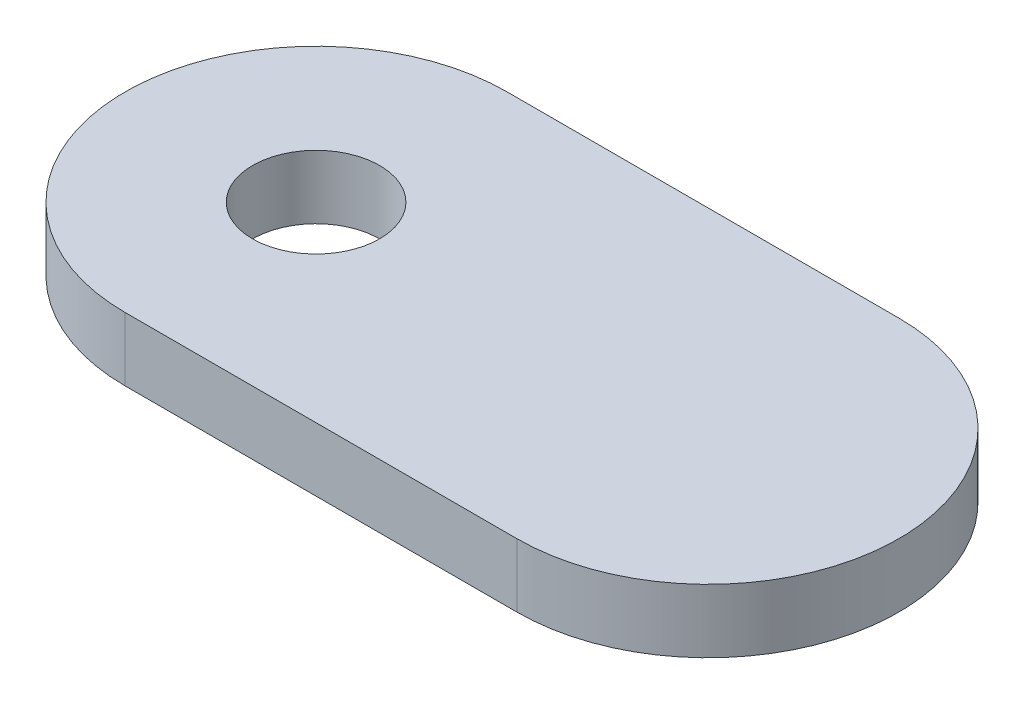
ISO-10303-21;
HEADER;
FILE_DESCRIPTION(('STEP AP214'),'2;1');
FILE_NAME('part.step','',(''),(''),'','','');
FILE_SCHEMA(('AUTOMOTIVE_DESIGN { 1 0 10303 214 1 1 1 1 }'));
ENDSEC;
DATA;
#1=APPLICATION_CONTEXT('core data for automotive mechanical design processes');
#2=APPLICATION_PROTOCOL_DEFINITION('international standard','automotive_design',2000,#1);
#3=PRODUCT_CONTEXT('',#1,'mechanical');
#4=PRODUCT('Part','Part','',(#3));
#5=PRODUCT_RELATED_PRODUCT_CATEGORY('part','',(#4));
#6=PRODUCT_DEFINITION_FORMATION('','',#4);
#7=PRODUCT_DEFINITION_CONTEXT('part definition',#1,'design');
#8=PRODUCT_DEFINITION('design','',#6,#7);
#9=PRODUCT_DEFINITION_SHAPE('','',#8);
#10=(LENGTH_UNIT() NAMED_UNIT(*) SI_UNIT(.MILLI.,.METRE.));
#11=(NAMED_UNIT(*) PLANE_ANGLE_UNIT() SI_UNIT($,.RADIAN.));
#12=(NAMED_UNIT(*) SI_UNIT($,.STERADIAN.) SOLID_ANGLE_UNIT());
#13=UNCERTAINTY_MEASURE_WITH_UNIT(LENGTH_MEASURE(1.E-05),#10,'distance_accuracy_value','');
#14=(GEOMETRIC_REPRESENTATION_CONTEXT(3) GLOBAL_UNCERTAINTY_ASSIGNED_CONTEXT((#13)) GLOBAL_UNIT_ASSIGNED_CONTEXT((#10,
#11,#12)) REPRESENTATION_CONTEXT('',''));
#15=CARTESIAN_POINT('',(0.,0.,0.));
#16=DIRECTION('',(0.,0.,1.));
#17=DIRECTION('',(1.,0.,0.));
#18=AXIS2_PLACEMENT_3D('',#15,#16,#17);
#19=CARTESIAN_POINT('',(0.,10.,0.));
#20=DIRECTION('',(0.,-1.,0.));
#21=DIRECTION('',(0.,0.,-1.));
#22=AXIS2_PLACEMENT_3D('',#19,#20,#21);
#23=CYLINDRICAL_SURFACE('',#22,30.0320866894288);
#24=CARTESIAN_POINT('',(0.,0.,0.));
#25=DIRECTION('',(0.,1.,0.));
#26=DIRECTION('',(0.,0.,1.));
#27=AXIS2_PLACEMENT_3D('',#24,#25,#26);
#28=CIRCLE('',#27,30.0320866894288);
#29=CARTESIAN_POINT('',(0.,0.,-30.0320866894288));
#30=VERTEX_POINT('',#29);
#31=CARTESIAN_POINT('',(0.,0.,30.0320866894288));
#32=VERTEX_POINT('',#31);
#33=EDGE_CURVE('E98',#30,#32,#28,.T.);
#34=ORIENTED_EDGE('',*,*,#33,.T.);
#35=DIRECTION('',(0.,-1.,0.));
#36=VECTOR('',#35,1.);
#37=CARTESIAN_POINT('',(0.,10.,30.0320866894288));
#38=LINE('',#37,#36);
#39=CARTESIAN_POINT('',(0.,10.,30.0320866894288));
#40=VERTEX_POINT('',#39);
#41=EDGE_CURVE('E11',#40,#32,#38,.T.);
#42=ORIENTED_EDGE('',*,*,#41,.F.);
#43=CARTESIAN_POINT('',(0.,10.,0.));
#44=DIRECTION('',(0.,1.,0.));
#45=DIRECTION('',(0.,0.,1.));
#46=AXIS2_PLACEMENT_3D('',#43,#44,#45);
#47=CIRCLE('',#46,30.0320866894288);
#48=CARTESIAN_POINT('',(0.,10.,-30.0320866894288));
#49=VERTEX_POINT('',#48);
#50=EDGE_CURVE('E86',#49,#40,#47,.T.);
#51=ORIENTED_EDGE('',*,*,#50,.F.);
#52=DIRECTION('',(0.,-1.,0.));
#53=VECTOR('',#52,1.);
#54=CARTESIAN_POINT('',(0.,10.,-30.0320866894288));
#55=LINE('',#54,#53);
#56=EDGE_CURVE('E94',#49,#30,#55,.T.);
#57=ORIENTED_EDGE('',*,*,#56,.T.);
#58=EDGE_LOOP('',(#34,#42,#51,#57));
#59=FACE_BOUND('',#58,.T.);
#60=ADVANCED_FACE('F35',(#59),#23,.T.);
#61=CARTESIAN_POINT('',(0.,10.,30.0320866894288));
#62=DIRECTION('',(0.,0.,-1.));
#63=DIRECTION('',(-1.,0.,0.));
#64=AXIS2_PLACEMENT_3D('',#61,#62,#63);
#65=PLANE('',#64);
#66=DIRECTION('',(1.,0.,0.));
#67=VECTOR('',#66,1.);
#68=CARTESIAN_POINT('',(0.,0.,30.0320866894288));
#69=LINE('',#68,#67);
#70=CARTESIAN_POINT('',(61.6042803885719,0.,30.0320866894288));
#71=VERTEX_POINT('',#70);
#72=EDGE_CURVE('E90',#32,#71,#69,.T.);
#73=ORIENTED_EDGE('',*,*,#72,.T.);
#74=DIRECTION('',(0.,-1.,0.));
#75=VECTOR('',#74,1.);
#76=CARTESIAN_POINT('',(61.6042803885719,10.,30.0320866894288));
#77=LINE('',#76,#75);
#78=CARTESIAN_POINT('',(61.6042803885719,10.,30.0320866894288));
#79=VERTEX_POINT('',#78);
#80=EDGE_CURVE('E43',#79,#71,#77,.T.);
#81=ORIENTED_EDGE('',*,*,#80,.F.);
#82=DIRECTION('',(1.,0.,0.));
#83=VECTOR('',#82,1.);
#84=CARTESIAN_POINT('',(0.,10.,30.0320866894288));
#85=LINE('',#84,#83);
#86=EDGE_CURVE('E81',#40,#79,#85,.T.);
#87=ORIENTED_EDGE('',*,*,#86,.F.);
#88=ORIENTED_EDGE('',*,*,#41,.T.);
#89=EDGE_LOOP('',(#73,#81,#87,#88));
#90=FACE_BOUND('',#89,.T.);
#91=ADVANCED_FACE('F89',(#90),#65,.F.);
#92=CARTESIAN_POINT('',(61.6042803885719,10.,0.));
#93=DIRECTION('',(0.,-1.,0.));
#94=DIRECTION('',(0.,0.,-1.));
#95=AXIS2_PLACEMENT_3D('',#92,#93,#94);
#96=CYLINDRICAL_SURFACE('',#95,30.0320866894288);
#97=CARTESIAN_POINT('',(61.6042803885719,0.,0.));
#98=DIRECTION('',(0.,1.,0.));
#99=DIRECTION('',(0.,0.,1.));
#100=AXIS2_PLACEMENT_3D('',#97,#98,#99);
#101=CIRCLE('',#100,30.0320866894288);
#102=CARTESIAN_POINT('',(61.6042803885719,0.,-30.0320866894288));
#103=VERTEX_POINT('',#102);
#104=EDGE_CURVE('E68',#71,#103,#101,.T.);
#105=ORIENTED_EDGE('',*,*,#104,.T.);
#106=DIRECTION('',(0.,-1.,0.));
#107=VECTOR('',#106,1.);
#108=CARTESIAN_POINT('',(61.6042803885719,10.,-30.0320866894288));
#109=LINE('',#108,#107);
#110=CARTESIAN_POINT('',(61.6042803885719,10.,-30.0320866894288));
#111=VERTEX_POINT('',#110);
#112=EDGE_CURVE('E91',#111,#103,#109,.T.);
#113=ORIENTED_EDGE('',*,*,#112,.F.);
#114=CARTESIAN_POINT('',(61.6042803885719,10.,0.));
#115=DIRECTION('',(0.,1.,0.));
#116=DIRECTION('',(0.,0.,1.));
#117=AXIS2_PLACEMENT_3D('',#114,#115,#116);
#118=CIRCLE('',#117,30.0320866894288);
#119=EDGE_CURVE('E84',#79,#111,#118,.T.);
#120=ORIENTED_EDGE('',*,*,#119,.F.);
#121=ORIENTED_EDGE('',*,*,#80,.T.);
#122=EDGE_LOOP('',(#105,#113,#120,#121));
#123=FACE_BOUND('',#122,.T.);
#124=ADVANCED_FACE('F92',(#123),#96,.T.);
#125=CARTESIAN_POINT('',(0.,10.,-30.0320866894288));
#126=DIRECTION('',(0.,0.,1.));
#127=DIRECTION('',(1.,0.,0.));
#128=AXIS2_PLACEMENT_3D('',#125,#126,#127);
#129=PLANE('',#128);
#130=DIRECTION('',(-1.,0.,0.));
#131=VECTOR('',#130,1.);
#132=CARTESIAN_POINT('',(0.,0.,-30.0320866894288));
#133=LINE('',#132,#131);
#134=EDGE_CURVE('E74',#103,#30,#133,.T.);
#135=ORIENTED_EDGE('',*,*,#134,.T.);
#136=ORIENTED_EDGE('',*,*,#56,.F.);
#137=DIRECTION('',(-1.,0.,0.));
#138=VECTOR('',#137,1.);
#139=CARTESIAN_POINT('',(0.,10.,-30.0320866894288));
#140=LINE('',#139,#138);
#141=EDGE_CURVE('E51',#111,#49,#140,.T.);
#142=ORIENTED_EDGE('',*,*,#141,.F.);
#143=ORIENTED_EDGE('',*,*,#112,.T.);
#144=EDGE_LOOP('',(#135,#136,#142,#143));
#145=FACE_BOUND('',#144,.T.);
#146=ADVANCED_FACE('F106',(#145),#129,.F.);
#147=CARTESIAN_POINT('',(0.,10.,0.));
#148=DIRECTION('',(0.,1.,0.));
#149=DIRECTION('',(0.,0.,1.));
#150=AXIS2_PLACEMENT_3D('',#147,#148,#149);
#151=PLANE('',#150);
#152=CARTESIAN_POINT('',(0.,10.,0.));
#153=DIRECTION('',(0.,1.,0.));
#154=DIRECTION('',(0.,0.,1.));
#155=AXIS2_PLACEMENT_3D('',#152,#153,#154);
#156=CIRCLE('',#155,9.99307311000058);
#157=CARTESIAN_POINT('',(0.,10.,9.99307311000058));
#158=VERTEX_POINT('',#157);
#159=EDGE_CURVE('E114',#158,#158,#156,.T.);
#160=ORIENTED_EDGE('',*,*,#159,.F.);
#161=EDGE_LOOP('',(#160));
#162=FACE_BOUND('',#161,.T.);
#163=ORIENTED_EDGE('',*,*,#50,.T.);
#164=ORIENTED_EDGE('',*,*,#86,.T.);
#165=ORIENTED_EDGE('',*,*,#119,.T.);
#166=ORIENTED_EDGE('',*,*,#141,.T.);
#167=EDGE_LOOP('',(#163,#164,#165,#166));
#168=FACE_BOUND('',#167,.T.);
#169=ADVANCED_FACE('F82',(#162,#168),#151,.T.);
#170=CARTESIAN_POINT('',(0.,0.,0.));
#171=DIRECTION('',(0.,1.,0.));
#172=DIRECTION('',(0.,0.,1.));
#173=AXIS2_PLACEMENT_3D('',#170,#171,#172);
#174=PLANE('',#173);
#175=CARTESIAN_POINT('',(0.,0.,0.));
#176=DIRECTION('',(0.,1.,0.));
#177=DIRECTION('',(0.,0.,1.));
#178=AXIS2_PLACEMENT_3D('',#175,#176,#177);
#179=CIRCLE('',#178,9.99307311000058);
#180=CARTESIAN_POINT('',(0.,0.,9.99307311000058));
#181=VERTEX_POINT('',#180);
#182=EDGE_CURVE('E101',#181,#181,#179,.F.);
#183=ORIENTED_EDGE('',*,*,#182,.F.);
#184=EDGE_LOOP('',(#183));
#185=FACE_BOUND('',#184,.T.);
#186=ORIENTED_EDGE('',*,*,#33,.F.);
#187=ORIENTED_EDGE('',*,*,#134,.F.);
#188=ORIENTED_EDGE('',*,*,#104,.F.);
#189=ORIENTED_EDGE('',*,*,#72,.F.);
#190=EDGE_LOOP('',(#186,#187,#188,#189));
#191=FACE_BOUND('',#190,.T.);
#192=ADVANCED_FACE('F109',(#185,#191),#174,.F.);
#193=CARTESIAN_POINT('',(0.,-0.000999999999999265,0.));
#194=DIRECTION('',(0.,1.,0.));
#195=DIRECTION('',(0.,0.,1.));
#196=AXIS2_PLACEMENT_3D('',#193,#194,#195);
#197=CYLINDRICAL_SURFACE('',#196,9.99307311000058);
#198=ORIENTED_EDGE('',*,*,#159,.T.);
#199=EDGE_LOOP('',(#198));
#200=FACE_BOUND('',#199,.T.);
#201=ORIENTED_EDGE('',*,*,#182,.T.);
#202=EDGE_LOOP('',(#201));
#203=FACE_BOUND('',#202,.T.);
#204=ADVANCED_FACE('F118',(#200,#203),#197,.F.);
#205=CLOSED_SHELL('',(#60,#91,#124,#146,#169,#192,#204));
#206=MANIFOLD_SOLID_BREP('B2',#205);
#207=ADVANCED_BREP_SHAPE_REPRESENTATION('',(#18,#206),#14);
#208=SHAPE_DEFINITION_REPRESENTATION(#9,#207);
ENDSEC;
END-ISO-10303-21;
